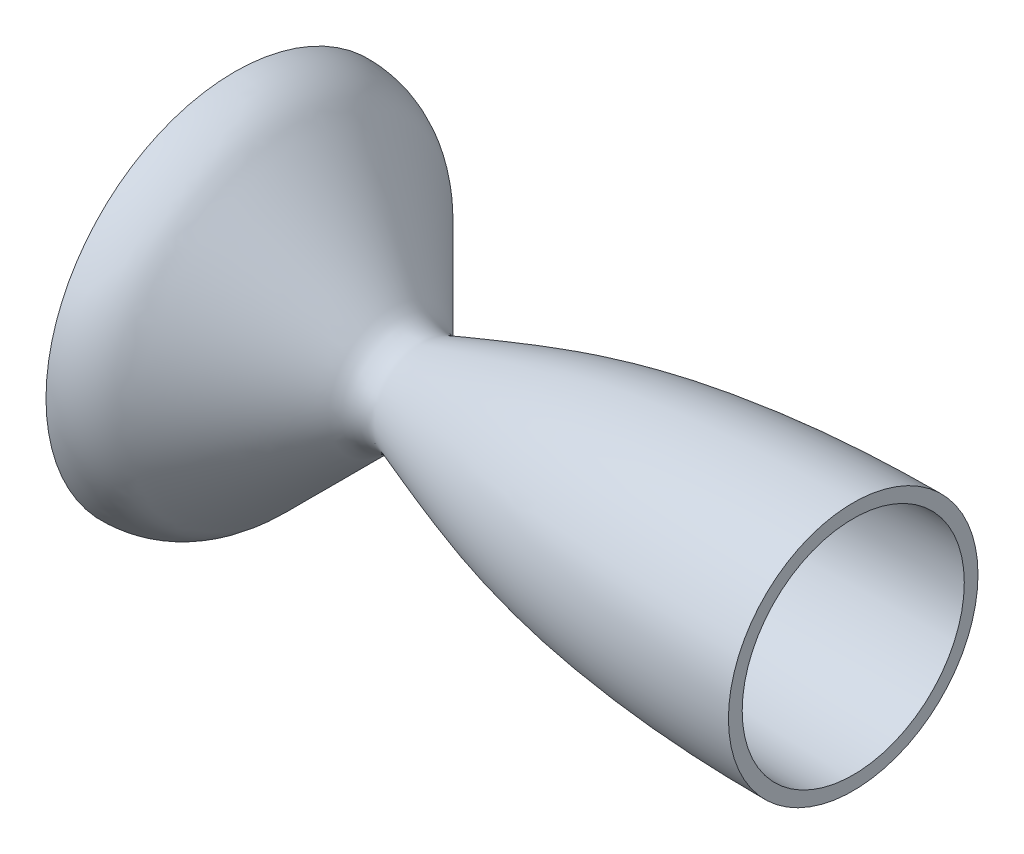
ISO-10303-21;
HEADER;
FILE_DESCRIPTION(('STEP AP214'),'2;1');
FILE_NAME('part.step','',(''),(''),'','','');
FILE_SCHEMA(('AUTOMOTIVE_DESIGN { 1 0 10303 214 1 1 1 1 }'));
ENDSEC;
DATA;
#1=APPLICATION_CONTEXT('core data for automotive mechanical design processes');
#2=APPLICATION_PROTOCOL_DEFINITION('international standard','automotive_design',2000,#1);
#3=PRODUCT_CONTEXT('',#1,'mechanical');
#4=PRODUCT('Part','Part','',(#3));
#5=PRODUCT_RELATED_PRODUCT_CATEGORY('part','',(#4));
#6=PRODUCT_DEFINITION_FORMATION('','',#4);
#7=PRODUCT_DEFINITION_CONTEXT('part definition',#1,'design');
#8=PRODUCT_DEFINITION('design','',#6,#7);
#9=PRODUCT_DEFINITION_SHAPE('','',#8);
#10=(LENGTH_UNIT() NAMED_UNIT(*) SI_UNIT(.MILLI.,.METRE.));
#11=(NAMED_UNIT(*) PLANE_ANGLE_UNIT() SI_UNIT($,.RADIAN.));
#12=(NAMED_UNIT(*) SI_UNIT($,.STERADIAN.) SOLID_ANGLE_UNIT());
#13=UNCERTAINTY_MEASURE_WITH_UNIT(LENGTH_MEASURE(1.E-05),#10,'distance_accuracy_value','');
#14=(GEOMETRIC_REPRESENTATION_CONTEXT(3) GLOBAL_UNCERTAINTY_ASSIGNED_CONTEXT((#13)) GLOBAL_UNIT_ASSIGNED_CONTEXT((#10,
#11,#12)) REPRESENTATION_CONTEXT('',''));
#15=CARTESIAN_POINT('',(0.,0.,0.));
#16=DIRECTION('',(0.,0.,1.));
#17=DIRECTION('',(1.,0.,0.));
#18=AXIS2_PLACEMENT_3D('',#15,#16,#17);
#19=CARTESIAN_POINT('',(-54.1471232638886,51.0012351428566,0.));
#20=CARTESIAN_POINT('',(-53.6298282804512,50.9883768752368,0.));
#21=CARTESIAN_POINT('',(-53.166147486792,50.9757702822123,0.));
#22=CARTESIAN_POINT('',(-52.655171789972,50.9424718281126,0.));
#23=CARTESIAN_POINT('',(-52.5578048154053,50.9351017689107,0.));
#24=CARTESIAN_POINT('',(-52.3612230505684,50.9178899490382,0.));
#25=CARTESIAN_POINT('',(-52.2621112558039,50.9080753438101,0.));
#26=CARTESIAN_POINT('',(-51.962395816464,50.8750926746424,0.));
#27=CARTESIAN_POINT('',(-51.7594091594787,50.8483810057531,0.));
#28=CARTESIAN_POINT('',(-51.347621091327,50.7860894493161,0.));
#29=CARTESIAN_POINT('',(-51.1374105561628,50.7502906185247,0.));
#30=CARTESIAN_POINT('',(-50.7201695778839,50.6718818268503,0.));
#31=CARTESIAN_POINT('',(-50.5131675820618,50.6292207672344,0.));
#32=CARTESIAN_POINT('',(-49.8974422290157,50.490718100425,0.));
#33=CARTESIAN_POINT('',(-49.4952510702746,50.3845893049089,0.));
#34=CARTESIAN_POINT('',(-48.2958752660025,50.0193322512722,0.));
#35=CARTESIAN_POINT('',(-47.5102039503375,49.7150419739881,0.));
#36=CARTESIAN_POINT('',(-45.9990465614248,48.9972159498144,0.));
#37=CARTESIAN_POINT('',(-45.2642581351856,48.5791830636145,0.));
#38=CARTESIAN_POINT('',(-44.2245510057489,47.8816441656656,0.));
#39=CARTESIAN_POINT('',(-43.8909783307504,47.6390969781166,0.));
#40=CARTESIAN_POINT('',(-43.2342368249403,47.1218932834484,0.));
#41=CARTESIAN_POINT('',(-42.9098844479494,46.8465912190218,0.));
#42=CARTESIAN_POINT('',(-42.4299994917717,46.4115699990174,0.));
#43=CARTESIAN_POINT('',(-42.2723195677324,46.2638784341407,0.));
#44=CARTESIAN_POINT('',(-41.9479468950545,45.9517821412586,0.));
#45=CARTESIAN_POINT('',(-41.7822565896145,45.7884093918841,0.));
#46=CARTESIAN_POINT('',(-41.4424109541458,45.4484842531824,0.));
#47=CARTESIAN_POINT('',(-41.2682582001191,45.2719343517672,0.));
#48=CARTESIAN_POINT('',(-40.9096961523793,44.9075298298338,0.));
#49=CARTESIAN_POINT('',(-40.7232987867268,44.7177707388719,0.));
#50=CARTESIAN_POINT('',(-40.1603078435408,44.1491750536256,0.));
#51=CARTESIAN_POINT('',(-39.7875015953691,43.7772554294251,0.));
#52=CARTESIAN_POINT('',(-39.0508091646902,43.0437255965091,0.));
#53=CARTESIAN_POINT('',(-38.688844381673,42.6835162315854,0.));
#54=CARTESIAN_POINT('',(-37.5978462273504,41.5934819746451,0.));
#55=CARTESIAN_POINT('',(-36.8652771893235,40.8588787770824,0.));
#56=CARTESIAN_POINT('',(-35.4007918875027,39.3944397919046,0.));
#57=CARTESIAN_POINT('',(-34.6702031048355,38.6642177683363,0.));
#58=CARTESIAN_POINT('',(-33.2077870330835,37.2016943896428,0.));
#59=CARTESIAN_POINT('',(-32.4762106475604,36.4700900090985,0.));
#60=CARTESIAN_POINT('',(-30.2821817869586,34.2761122466479,0.));
#61=CARTESIAN_POINT('',(-28.8195299647783,32.8134340986929,0.));
#62=CARTESIAN_POINT('',(-24.4314961132103,28.4253998533454,0.));
#63=CARTESIAN_POINT('',(-21.505725542961,25.5000479303297,0.));
#64=CARTESIAN_POINT('',(-17.849812609089,21.8435712354376,0.));
#65=CARTESIAN_POINT('',(-17.1171532632688,21.1108723022749,0.));
#66=CARTESIAN_POINT('',(-16.0200988657296,20.0144695097423,0.));
#67=CARTESIAN_POINT('',(-15.6550438718733,19.6495974927566,0.));
#68=CARTESIAN_POINT('',(-14.9266318411465,18.9205360961866,0.));
#69=CARTESIAN_POINT('',(-14.5627820160204,18.5555388579991,0.));
#70=CARTESIAN_POINT('',(-14.0117396928971,18.0037408579398,0.));
#71=CARTESIAN_POINT('',(-13.827393253639,17.819329009563,0.));
#72=CARTESIAN_POINT('',(-13.4571542539861,17.4497928389858,0.));
#73=CARTESIAN_POINT('',(-13.2704011856784,17.2638602196551,0.));
#74=CARTESIAN_POINT('',(-12.7140511187595,16.7115606399874,0.));
#75=CARTESIAN_POINT('',(-12.3511621777805,16.3527876740375,0.));
#76=CARTESIAN_POINT('',(-11.8232922770168,15.8235326627413,0.));
#77=CARTESIAN_POINT('',(-11.6500711702013,15.6486049639888,0.));
#78=CARTESIAN_POINT('',(-11.3097349954303,15.3009293300106,0.));
#79=CARTESIAN_POINT('',(-11.1316373036113,15.116584499117,0.));
#80=CARTESIAN_POINT('',(-10.5544026574852,14.5263725584253,0.));
#81=CARTESIAN_POINT('',(-10.1184097743889,14.0877319649155,0.));
#82=CARTESIAN_POINT('',(-9.4742007333335,13.521712843291,0.));
#83=CARTESIAN_POINT('',(-9.33933938546603,13.4069720147338,0.));
#84=CARTESIAN_POINT('',(-9.06582334940243,13.1828272717494,0.));
#85=CARTESIAN_POINT('',(-8.92683713581147,13.072994901922,0.));
#86=CARTESIAN_POINT('',(-8.50327663436747,12.7505037431253,0.));
#87=CARTESIAN_POINT('',(-8.21210052430383,12.5448417608792,0.));
#88=CARTESIAN_POINT('',(-7.3127919708749,11.9584541919749,0.));
#89=CARTESIAN_POINT('',(-6.67258211170541,11.6070078701848,0.));
#90=CARTESIAN_POINT('',(-5.69951413765115,11.1640605048875,0.));
#91=CARTESIAN_POINT('',(-5.37246796253318,11.0294858782779,0.));
#92=CARTESIAN_POINT('',(-4.71507315317896,10.7848629823604,0.));
#93=CARTESIAN_POINT('',(-4.38877106128746,10.6756862247669,0.));
#94=CARTESIAN_POINT('',(-3.36894493127642,10.3735144421059,0.));
#95=CARTESIAN_POINT('',(-2.63497428577359,10.2089150560874,0.));
#96=CARTESIAN_POINT('',(-1.45705405596841,10.0735535444163,0.));
#97=CARTESIAN_POINT('',(-1.04377093448458,10.0458269562717,0.));
#98=CARTESIAN_POINT('',(-0.173009545528111,10.0467854465552,0.));
#99=CARTESIAN_POINT('',(0.284462895417527,10.0754927322077,0.));
#100=CARTESIAN_POINT('',(0.880257513191357,10.1656602423608,0.));
#101=CARTESIAN_POINT('',(1.00058182381246,10.1864275749754,0.));
#102=CARTESIAN_POINT('',(1.24330989219951,10.2339681498194,0.));
#103=CARTESIAN_POINT('',(1.3662077874051,10.2609957687738,0.));
#104=CARTESIAN_POINT('',(1.71655753497794,10.3458212160398,0.));
#105=CARTESIAN_POINT('',(1.93256087821231,10.4083832849615,0.));
#106=CARTESIAN_POINT('',(2.53016308088772,10.5994903848257,0.));
#107=CARTESIAN_POINT('',(2.86184721426304,10.7303624934333,0.));
#108=CARTESIAN_POINT('',(3.27345869917867,10.8961186145193,0.));
#109=CARTESIAN_POINT('',(3.39628180595498,10.946559739445,0.));
#110=CARTESIAN_POINT('',(3.55957516979285,11.0127047210141,0.));
#111=CARTESIAN_POINT('',(3.61050536955316,11.0331801276468,0.));
#112=CARTESIAN_POINT('',(3.70534626728403,11.0707646484457,0.));
#113=CARTESIAN_POINT('',(3.7500678989309,11.0881870713951,0.));
#114=CARTESIAN_POINT('',(3.98562866152087,11.1784736253457,0.));
#115=CARTESIAN_POINT('',(4.18988147186104,11.2520014451125,0.));
#116=CARTESIAN_POINT('',(4.63023179592843,11.4052557469472,0.));
#117=CARTESIAN_POINT('',(4.86631051728929,11.4849700138697,0.));
#118=CARTESIAN_POINT('',(5.24338869926862,11.6133485015858,0.));
#119=CARTESIAN_POINT('',(5.37431051143523,11.6581786379139,0.));
#120=CARTESIAN_POINT('',(5.63234169585616,11.7474825491551,0.));
#121=CARTESIAN_POINT('',(5.76033289272824,11.7921764540884,0.));
#122=CARTESIAN_POINT('',(6.3953168253329,12.0153291932368,0.));
#123=CARTESIAN_POINT('',(6.88730505952978,12.1927138425847,0.));
#124=CARTESIAN_POINT('',(7.84324798402293,12.5332588876091,0.));
#125=CARTESIAN_POINT('',(8.32596148279044,12.7032198175079,0.));
#126=CARTESIAN_POINT('',(9.30008936946175,13.0458678807432,0.));
#127=CARTESIAN_POINT('',(9.79006322632026,13.2183928844283,0.));
#128=CARTESIAN_POINT('',(10.7639447241709,13.5611258961242,0.));
#129=CARTESIAN_POINT('',(11.2492851749944,13.7316505751884,0.));
#130=CARTESIAN_POINT('',(13.6795825150809,14.5829954183313,0.));
#131=CARTESIAN_POINT('',(15.625112895537,15.2585728946565,0.));
#132=CARTESIAN_POINT('',(21.459505390912,17.251910408114,0.));
#133=CARTESIAN_POINT('',(25.3508806949428,18.5380034653788,0.));
#134=CARTESIAN_POINT('',(31.204679197901,20.3460779928296,0.));
#135=CARTESIAN_POINT('',(33.1590087397995,20.9285982335439,0.));
#136=CARTESIAN_POINT('',(37.0754365775112,22.0443944718842,0.));
#137=CARTESIAN_POINT('',(39.0363729514962,22.5766387764498,0.));
#138=CARTESIAN_POINT('',(44.9451902192786,24.0948121208977,0.));
#139=CARTESIAN_POINT('',(48.9154035952696,25.0053001426547,0.));
#140=CARTESIAN_POINT('',(60.8902380093537,27.4589369616719,0.));
#141=CARTESIAN_POINT('',(68.9623222996468,28.7217686153884,0.));
#142=CARTESIAN_POINT('',(85.1998503266025,30.6554823573004,0.));
#143=CARTESIAN_POINT('',(93.3652088488644,31.3271554599704,0.));
#144=CARTESIAN_POINT('',(105.64206582446,31.9794294780722,0.));
#145=CARTESIAN_POINT('',(109.739520164541,32.1370367524927,0.));
#146=CARTESIAN_POINT('',(115.890846964709,32.2930016076863,0.));
#147=CARTESIAN_POINT('',(117.942314083783,32.331597716312,0.));
#148=CARTESIAN_POINT('',(121.020031589655,32.3705533752554,0.));
#149=CARTESIAN_POINT('',(122.047073863106,32.3803692050204,0.));
#150=CARTESIAN_POINT('',(124.098794868485,32.3940976610318,0.));
#151=CARTESIAN_POINT('',(125.12195194271,32.3965932357434,0.));
#152=CARTESIAN_POINT('',(126.156223571031,32.3984705894919,0.));
#153=B_SPLINE_CURVE_WITH_KNOTS('',3,(#19,#20,#21,#22,#23,#24,#25,#26,#27,#28,#29,#30,#31,#32,
#33,#34,#35,#36,#37,#38,#39,#40,#41,#42,#43,#44,#45,#46,#47,#48,#49,#50,#51,#52,#53,#54,#55,#56,
#57,#58,#59,#60,#61,#62,#63,#64,#65,#66,#67,#68,#69,#70,#71,#72,#73,#74,#75,#76,#77,#78,#79,#80,
#81,#82,#83,#84,#85,#86,#87,#88,#89,#90,#91,#92,#93,#94,#95,#96,#97,#98,#99,#100,#101,#102,#103,
#104,#105,#106,#107,#108,#109,#110,#111,#112,#113,#114,#115,#116,#117,#118,#119,#120,#121,#122,
#123,#124,#125,#126,#127,#128,#129,#130,#131,#132,#133,#134,#135,#136,#137,#138,#139,#140,#141,
#142,#143,#144,#145,#146,#147,#148,#149,#150,#151,#152),.UNSPECIFIED.,.F.,.F.,(4,2,2,2,2,2,2,2,
2,2,2,2,2,2,2,2,2,2,2,2,2,2,2,2,2,2,2,2,2,2,2,2,2,2,2,2,2,2,2,2,2,2,2,2,2,2,2,2,2,2,2,2,2,2,2,2,
2,2,2,2,2,2,2,2,2,2,4),(0.,0.00781249999999964,0.00976562499999958,0.0117187499999995,
0.0156249999999995,0.0195312499999996,0.0234374999999996,0.0312499999999996,0.0468749999999995,
0.0624999999999995,0.0703124999999995,0.0781249999999995,0.0820312499999995,0.0859374999999995,
0.0898437499999995,0.0937499999999994,0.101562499999999,0.109374999999999,0.124999999999999,
0.140624999999999,0.156249999999999,0.187499999999999,0.249999999999999,0.265624999999999,
0.2734375,0.28125,0.28515625,0.2890625,0.296875,0.30078125,0.3046875,0.3125,0.314453125,
0.31640625,0.3203125,0.328125,0.33203125,0.3359375,0.34375,0.34765625,0.3515625,0.3525390625,
0.353515625,0.35546875,0.359375,0.361328125,0.3623046875,0.36328125,0.3671875,0.37109375,
0.373046875,0.375,0.3828125,0.390625,0.3984375,0.40625,0.4375,0.5,0.53125,0.5625,0.625,0.75,
0.875,0.9375,0.96875,0.984375,1.),.UNSPECIFIED.);
#154=CARTESIAN_POINT('',(-13.7367192994668,0.0468941000539725,0.));
#155=DIRECTION('',(-1.,0.,0.));
#156=AXIS1_PLACEMENT('',#154,#155);
#157=SURFACE_OF_REVOLUTION('',#153,#156);
#158=CARTESIAN_POINT('',(126.156223571031,0.0468941000539725,0.));
#159=DIRECTION('',(-1.,0.,0.));
#160=DIRECTION('',(0.,0.,1.));
#161=AXIS2_PLACEMENT_3D('',#158,#159,#160);
#162=CIRCLE('',#161,32.3515764894379);
#163=CARTESIAN_POINT('',(126.156223571031,0.0468941000539725,32.3515764894379));
#164=VERTEX_POINT('',#163);
#165=EDGE_CURVE('E10',#164,#164,#162,.T.);
#166=ORIENTED_EDGE('',*,*,#165,.F.);
#167=EDGE_LOOP('',(#166));
#168=FACE_BOUND('',#167,.T.);
#169=CARTESIAN_POINT('',(-54.1471232638886,0.0468941000539725,0.));
#170=DIRECTION('',(-1.,0.,0.));
#171=DIRECTION('',(0.,0.,1.));
#172=AXIS2_PLACEMENT_3D('',#169,#170,#171);
#173=CIRCLE('',#172,50.9543410428027);
#174=CARTESIAN_POINT('',(-54.1471232638886,0.0468941000539725,50.9543410428027));
#175=VERTEX_POINT('',#174);
#176=EDGE_CURVE('E55',#175,#175,#173,.T.);
#177=ORIENTED_EDGE('',*,*,#176,.T.);
#178=EDGE_LOOP('',(#177));
#179=FACE_BOUND('',#178,.T.);
#180=ADVANCED_FACE('F37',(#168,#179),#157,.T.);
#181=CARTESIAN_POINT('',(126.148963,0.0468941000539725,0.));
#182=DIRECTION('',(-1.,0.,0.));
#183=DIRECTION('',(0.,0.,1.));
#184=AXIS2_PLACEMENT_3D('',#181,#182,#183);
#185=CONICAL_SURFACE('',#184,36.351569899946,1.56898118304031);
#186=ORIENTED_EDGE('',*,*,#165,.T.);
#187=EDGE_LOOP('',(#186));
#188=FACE_BOUND('',#187,.T.);
#189=CARTESIAN_POINT('',(126.148963,0.0468941000539725,0.));
#190=DIRECTION('',(-1.,0.,0.));
#191=DIRECTION('',(0.,0.,1.));
#192=AXIS2_PLACEMENT_3D('',#189,#190,#191);
#193=CIRCLE('',#192,36.351569899946);
#194=CARTESIAN_POINT('',(126.148963,0.0468941000539725,36.351569899946));
#195=VERTEX_POINT('',#194);
#196=EDGE_CURVE('E45',#195,#195,#193,.T.);
#197=ORIENTED_EDGE('',*,*,#196,.F.);
#198=EDGE_LOOP('',(#197));
#199=FACE_BOUND('',#198,.T.);
#200=ADVANCED_FACE('F75',(#188,#199),#185,.T.);
#201=CARTESIAN_POINT('',(-54.047727,55.,0.));
#202=CARTESIAN_POINT('',(-53.4457290935766,54.9850362937295,0.));
#203=CARTESIAN_POINT('',(-52.2372248315047,54.9549968158319,0.));
#204=CARTESIAN_POINT('',(-50.4264129961468,54.7105995241454,0.));
#205=CARTESIAN_POINT('',(-48.6149217164949,54.3143634765646,0.));
#206=CARTESIAN_POINT('',(-46.8023061689535,53.741662572346,0.));
#207=CARTESIAN_POINT('',(-44.9877124275388,52.9805455541392,0.));
#208=CARTESIAN_POINT('',(-43.1704932314813,52.0043620646783,0.));
#209=CARTESIAN_POINT('',(-41.3462287947449,50.7770610992306,0.));
#210=CARTESIAN_POINT('',(-39.5455510844752,49.2438837135932,0.));
#211=CARTESIAN_POINT('',(-37.818348474036,47.4559539494038,0.));
#212=CARTESIAN_POINT('',(-35.9479576568401,45.6026514946183,0.));
#213=CARTESIAN_POINT('',(-34.0864845201817,43.7362542321814,0.));
#214=CARTESIAN_POINT('',(-32.2219768563047,41.872988815917,0.));
#215=CARTESIAN_POINT('',(-30.4183644414448,40.069054818821,0.));
#216=CARTESIAN_POINT('',(-28.6145523778929,38.265326908823,0.));
#217=CARTESIAN_POINT('',(-26.8107920469884,36.4615455458822,0.));
#218=CARTESIAN_POINT('',(-24.4057606187679,34.056522083789,0.));
#219=CARTESIAN_POINT('',(-22.0007372173677,31.6514896808658,0.));
#220=CARTESIAN_POINT('',(-19.5957029824212,29.2464699836017,0.));
#221=CARTESIAN_POINT('',(-17.7919523700117,27.442676267383,0.));
#222=CARTESIAN_POINT('',(-15.9279814653302,25.5788660584138,0.));
#223=CARTESIAN_POINT('',(-14.0643770464014,23.7146319602466,0.));
#224=CARTESIAN_POINT('',(-12.1994670732407,21.8519082774316,0.));
#225=CARTESIAN_POINT('',(-10.3994001872664,20.0438519298371,0.));
#226=CARTESIAN_POINT('',(-8.59018143170391,18.2643375610311,0.));
#227=CARTESIAN_POINT('',(-6.92973946455222,16.499304663844,0.));
#228=CARTESIAN_POINT('',(-5.08419857393616,15.2315523789376,0.));
#229=CARTESIAN_POINT('',(-3.2319205849737,14.4555613684476,0.));
#230=CARTESIAN_POINT('',(-1.40698218715965,14.020378830665,0.));
#231=CARTESIAN_POINT('',(0.493649610972355,14.0278122562884,0.));
#232=CARTESIAN_POINT('',(2.22087673189095,14.8254334625245,0.));
#233=CARTESIAN_POINT('',(4.09647442888185,15.4375263711822,0.));
#234=CARTESIAN_POINT('',(5.95680683253004,16.1108751826174,0.));
#235=CARTESIAN_POINT('',(7.82144309803842,16.765582997068,0.));
#236=CARTESIAN_POINT('',(9.62485759351885,17.401255943235,0.));
#237=CARTESIAN_POINT('',(11.4285548416986,18.0327638566936,0.));
#238=CARTESIAN_POINT('',(13.2321794225322,18.6606828947606,0.));
#239=CARTESIAN_POINT('',(15.6358360259497,19.4910432725345,0.));
#240=CARTESIAN_POINT('',(18.6397878044022,20.5148028277345,0.));
#241=CARTESIAN_POINT('',(22.3062426743378,21.734463876544,0.));
#242=CARTESIAN_POINT('',(25.3744830569567,22.7234960816328,0.));
#243=CARTESIAN_POINT('',(27.8418000767392,23.4957007993932,0.));
#244=CARTESIAN_POINT('',(29.6454920830542,24.0484416146809,0.));
#245=CARTESIAN_POINT('',(32.0480037108649,24.7679817348411,0.));
#246=CARTESIAN_POINT('',(34.4528504139346,25.4617207036689,0.));
#247=CARTESIAN_POINT('',(36.8603559815707,26.1266477493914,0.));
#248=CARTESIAN_POINT('',(38.6641868881348,26.609261843741,0.));
#249=CARTESIAN_POINT('',(40.4680575775743,27.0764251523445,0.));
#250=CARTESIAN_POINT('',(42.9308275803307,27.6937131513627,0.));
#251=CARTESIAN_POINT('',(45.9950173258565,28.4231739921454,0.));
#252=CARTESIAN_POINT('',(49.6635796147926,29.2385713213234,0.));
#253=CARTESIAN_POINT('',(53.2716502462861,29.9868873828492,0.));
#254=CARTESIAN_POINT('',(57.4784743919367,30.7990742361441,0.));
#255=CARTESIAN_POINT('',(61.748052583471,31.5498668046807,0.));
#256=CARTESIAN_POINT('',(66.6191828731743,32.3262164590168,0.));
#257=CARTESIAN_POINT('',(70.8889764892976,32.9399138825608,0.));
#258=CARTESIAN_POINT('',(75.0998110022851,33.4841601405315,0.));
#259=CARTESIAN_POINT('',(79.3077329390562,33.9812766709504,0.));
#260=CARTESIAN_POINT('',(84.1771624852569,34.4917674102877,0.));
#261=CARTESIAN_POINT('',(88.4484721358029,34.8738748055165,0.));
#262=CARTESIAN_POINT('',(92.7177507541131,35.2142316457256,0.));
#263=CARTESIAN_POINT('',(96.3249646145246,35.4683097854351,0.));
#264=CARTESIAN_POINT('',(101.195442616729,35.7573346972248,0.));
#265=CARTESIAN_POINT('',(106.065535609566,35.992911920679,0.));
#266=CARTESIAN_POINT('',(110.936462984481,36.1677146783299,0.));
#267=CARTESIAN_POINT('',(114.544517220247,36.2621025279133,0.));
#268=CARTESIAN_POINT('',(116.949670881259,36.3114799319661,0.));
#269=CARTESIAN_POINT('',(118.753454621183,36.3418507257813,0.));
#270=CARTESIAN_POINT('',(120.557237650963,36.365726668058,0.));
#271=CARTESIAN_POINT('',(122.361020155006,36.3830740741126,0.));
#272=CARTESIAN_POINT('',(124.224926179368,36.3949715927459,0.));
#273=CARTESIAN_POINT('',(125.48757872063,36.3972634911375,0.));
#274=CARTESIAN_POINT('',(126.148963,36.398464,0.));
#275=B_SPLINE_CURVE_WITH_KNOTS('',3,(#201,#202,#203,#204,#205,#206,#207,#208,#209,#210,#211,
#212,#213,#214,#215,#216,#217,#218,#219,#220,#221,#222,#223,#224,#225,#226,#227,#228,#229,#230,
#231,#232,#233,#234,#235,#236,#237,#238,#239,#240,#241,#242,#243,#244,#245,#246,#247,#248,#249,
#250,#251,#252,#253,#254,#255,#256,#257,#258,#259,#260,#261,#262,#263,#264,#265,#266,#267,#268,
#269,#270,#271,#272,#273,#274),.UNSPECIFIED.,.F.,.F.,(4,1,1,1,1,1,1,1,1,1,1,1,1,1,1,1,1,1,1,1,1,
1,1,1,1,1,1,1,1,1,1,1,1,1,1,1,1,1,1,1,1,1,1,1,1,1,1,1,1,1,1,1,1,1,1,1,1,1,1,1,1,1,1,1,1,1,1,1,1,
1,1,4),(0.,0.00909173449291941,0.0182515582979314,0.0275522824557242,0.037077137808422,
0.0469277991705027,0.0572371892955199,0.0681924893286101,0.0800817730915253,0.0928866371052304,
0.105732413366917,0.1198627629818,0.132708535682676,0.145554311944363,0.158400084645239,
0.171245857346115,0.184091633607802,0.209783179009554,0.222628955271241,0.235474727972117,
0.248320500672994,0.262450853848687,0.275296626549563,0.28814240281125,0.300988175512126,
0.313656140808286,0.324653435503448,0.334520557443622,0.343827618577229,0.352915940953597,
0.362550831654908,0.37218658585663,0.382785175045628,0.392418018668068,0.402047238143011,
0.411671402507605,0.421289108515156,0.430898967438216,0.450089748013703,0.4692333411569,
0.489272762108117,0.498790332225127,0.508290404702778,0.517772174160981,0.536678230657863,
0.546101430101746,0.555504257157091,0.564887324542591,0.574251694923898,0.593860446058296,
0.61247082531334,0.631024459173742,0.649526953326083,0.677196331835081,0.696512466133505,
0.724043409297687,0.742361419238007,0.760654639932068,0.788054583919336,0.816325963450734,
0.825438124341647,0.852756014097759,0.870954732290247,0.899146308526481,0.926414093249041,
0.944587028882756,0.95367228022923,0.962756905501922,0.971841031284416,0.980924792465568,
0.990008302381907,1.),.UNSPECIFIED.);
#276=CARTESIAN_POINT('',(-13.7367192994668,0.0468941000539725,0.));
#277=DIRECTION('',(-1.,0.,0.));
#278=AXIS1_PLACEMENT('',#276,#277);
#279=SURFACE_OF_REVOLUTION('',#275,#278);
#280=ORIENTED_EDGE('',*,*,#196,.T.);
#281=EDGE_LOOP('',(#280));
#282=FACE_BOUND('',#281,.T.);
#283=CARTESIAN_POINT('',(-54.047727,0.0468941000539725,0.));
#284=DIRECTION('',(-1.,0.,0.));
#285=DIRECTION('',(0.,0.,1.));
#286=AXIS2_PLACEMENT_3D('',#283,#284,#285);
#287=CIRCLE('',#286,54.953105899946);
#288=CARTESIAN_POINT('',(-54.047727,0.0468941000539725,54.953105899946));
#289=VERTEX_POINT('',#288);
#290=EDGE_CURVE('E50',#289,#289,#287,.T.);
#291=ORIENTED_EDGE('',*,*,#290,.F.);
#292=EDGE_LOOP('',(#291));
#293=FACE_BOUND('',#292,.T.);
#294=ADVANCED_FACE('F71',(#282,#293),#279,.F.);
#295=CARTESIAN_POINT('',(-54.1471232638886,0.0468941000539725,0.));
#296=DIRECTION('',(1.,0.,0.));
#297=DIRECTION('',(0.,0.,-1.));
#298=AXIS2_PLACEMENT_3D('',#295,#296,#297);
#299=CONICAL_SURFACE('',#298,50.9543410428027,1.54594470282793);
#300=ORIENTED_EDGE('',*,*,#290,.T.);
#301=EDGE_LOOP('',(#300));
#302=FACE_BOUND('',#301,.T.);
#303=ORIENTED_EDGE('',*,*,#176,.F.);
#304=EDGE_LOOP('',(#303));
#305=FACE_BOUND('',#304,.T.);
#306=ADVANCED_FACE('F74',(#302,#305),#299,.T.);
#307=CLOSED_SHELL('',(#180,#200,#294,#306));
#308=MANIFOLD_SOLID_BREP('B2',#307);
#309=ADVANCED_BREP_SHAPE_REPRESENTATION('',(#18,#308),#14);
#310=SHAPE_DEFINITION_REPRESENTATION(#9,#309);
ENDSEC;
END-ISO-10303-21;
